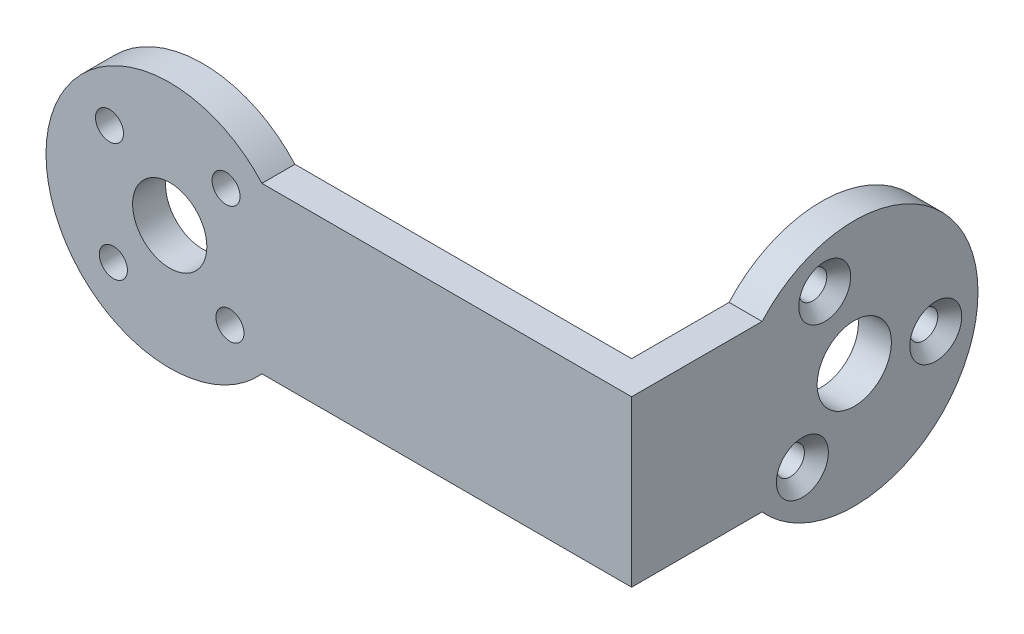
ISO-10303-21;
HEADER;
FILE_DESCRIPTION(('STEP AP214'),'2;1');
FILE_NAME('part.step','',(''),(''),'','','');
FILE_SCHEMA(('AUTOMOTIVE_DESIGN { 1 0 10303 214 1 1 1 1 }'));
ENDSEC;
DATA;
#1=APPLICATION_CONTEXT('core data for automotive mechanical design processes');
#2=APPLICATION_PROTOCOL_DEFINITION('international standard','automotive_design',2000,#1);
#3=PRODUCT_CONTEXT('',#1,'mechanical');
#4=PRODUCT('Part','Part','',(#3));
#5=PRODUCT_RELATED_PRODUCT_CATEGORY('part','',(#4));
#6=PRODUCT_DEFINITION_FORMATION('','',#4);
#7=PRODUCT_DEFINITION_CONTEXT('part definition',#1,'design');
#8=PRODUCT_DEFINITION('design','',#6,#7);
#9=PRODUCT_DEFINITION_SHAPE('','',#8);
#10=(LENGTH_UNIT() NAMED_UNIT(*) SI_UNIT(.MILLI.,.METRE.));
#11=(NAMED_UNIT(*) PLANE_ANGLE_UNIT() SI_UNIT($,.RADIAN.));
#12=(NAMED_UNIT(*) SI_UNIT($,.STERADIAN.) SOLID_ANGLE_UNIT());
#13=UNCERTAINTY_MEASURE_WITH_UNIT(LENGTH_MEASURE(1.E-05),#10,'distance_accuracy_value','');
#14=(GEOMETRIC_REPRESENTATION_CONTEXT(3) GLOBAL_UNCERTAINTY_ASSIGNED_CONTEXT((#13)) GLOBAL_UNIT_ASSIGNED_CONTEXT((#10,
#11,#12)) REPRESENTATION_CONTEXT('',''));
#15=CARTESIAN_POINT('',(0.,0.,0.));
#16=DIRECTION('',(0.,0.,1.));
#17=DIRECTION('',(1.,0.,0.));
#18=AXIS2_PLACEMENT_3D('',#15,#16,#17);
#19=CARTESIAN_POINT('',(0.,0.,0.));
#20=DIRECTION('',(0.,0.,1.));
#21=DIRECTION('',(1.,0.,0.));
#22=AXIS2_PLACEMENT_3D('',#19,#20,#21);
#23=PLANE('',#22);
#24=CARTESIAN_POINT('',(6.83081605405966,7.30342057091117,0.));
#25=DIRECTION('',(0.,0.,-1.));
#26=DIRECTION('',(-1.,0.,0.));
#27=AXIS2_PLACEMENT_3D('',#24,#25,#26);
#28=CIRCLE('',#27,3.15);
#29=CARTESIAN_POINT('',(3.68081605405966,7.30342057091117,0.));
#30=VERTEX_POINT('',#29);
#31=EDGE_CURVE('E147',#30,#30,#28,.T.);
#32=ORIENTED_EDGE('',*,*,#31,.F.);
#33=EDGE_LOOP('',(#32));
#34=FACE_BOUND('',#33,.T.);
#35=CARTESIAN_POINT('',(0.,0.,0.));
#36=DIRECTION('',(0.,0.,1.));
#37=DIRECTION('',(1.,0.,0.));
#38=AXIS2_PLACEMENT_3D('',#35,#36,#37);
#39=CIRCLE('',#38,4.5);
#40=CARTESIAN_POINT('',(4.5,0.,0.));
#41=VERTEX_POINT('',#40);
#42=EDGE_CURVE('E122',#41,#41,#39,.T.);
#43=ORIENTED_EDGE('',*,*,#42,.T.);
#44=EDGE_LOOP('',(#43));
#45=FACE_BOUND('',#44,.T.);
#46=DIRECTION('',(-1.,0.,0.));
#47=VECTOR('',#46,1.);
#48=CARTESIAN_POINT('',(11.1803398874989,10.,0.));
#49=LINE('',#48,#47);
#50=CARTESIAN_POINT('',(52.,10.,0.));
#51=VERTEX_POINT('',#50);
#52=CARTESIAN_POINT('',(11.1803398874989,10.,0.));
#53=VERTEX_POINT('',#52);
#54=EDGE_CURVE('E74',#51,#53,#49,.T.);
#55=ORIENTED_EDGE('',*,*,#54,.F.);
#56=DIRECTION('',(0.,-1.,0.));
#57=VECTOR('',#56,1.);
#58=CARTESIAN_POINT('',(52.,10.,0.));
#59=LINE('',#58,#57);
#60=CARTESIAN_POINT('',(52.,-10.,0.));
#61=VERTEX_POINT('',#60);
#62=EDGE_CURVE('E114',#51,#61,#59,.T.);
#63=ORIENTED_EDGE('',*,*,#62,.T.);
#64=DIRECTION('',(1.,0.,0.));
#65=VECTOR('',#64,1.);
#66=CARTESIAN_POINT('',(11.1803398874989,-10.,0.));
#67=LINE('',#66,#65);
#68=CARTESIAN_POINT('',(11.1803398874989,-10.,0.));
#69=VERTEX_POINT('',#68);
#70=EDGE_CURVE('E113',#69,#61,#67,.T.);
#71=ORIENTED_EDGE('',*,*,#70,.F.);
#72=CARTESIAN_POINT('',(0.,0.,0.));
#73=DIRECTION('',(0.,0.,1.));
#74=DIRECTION('',(1.,0.,0.));
#75=AXIS2_PLACEMENT_3D('',#72,#73,#74);
#76=CIRCLE('',#75,15.);
#77=EDGE_CURVE('E127',#53,#69,#76,.T.);
#78=ORIENTED_EDGE('',*,*,#77,.F.);
#79=EDGE_LOOP('',(#55,#63,#71,#78));
#80=FACE_BOUND('',#79,.T.);
#81=CARTESIAN_POINT('',(7.30342057091089,-6.8308160540594,0.));
#82=DIRECTION('',(0.,0.,-1.));
#83=DIRECTION('',(-1.,0.,0.));
#84=AXIS2_PLACEMENT_3D('',#81,#82,#83);
#85=CIRCLE('',#84,3.15);
#86=CARTESIAN_POINT('',(4.15342057091089,-6.8308160540594,0.));
#87=VERTEX_POINT('',#86);
#88=EDGE_CURVE('E194',#87,#87,#85,.T.);
#89=ORIENTED_EDGE('',*,*,#88,.F.);
#90=EDGE_LOOP('',(#89));
#91=FACE_BOUND('',#90,.T.);
#92=CARTESIAN_POINT('',(-6.83081605405939,-7.30342057091089,0.));
#93=DIRECTION('',(0.,0.,-1.));
#94=DIRECTION('',(-1.,0.,0.));
#95=AXIS2_PLACEMENT_3D('',#92,#93,#94);
#96=CIRCLE('',#95,3.15);
#97=CARTESIAN_POINT('',(-9.9808160540594,-7.30342057091089,0.));
#98=VERTEX_POINT('',#97);
#99=EDGE_CURVE('E185',#98,#98,#96,.T.);
#100=ORIENTED_EDGE('',*,*,#99,.F.);
#101=EDGE_LOOP('',(#100));
#102=FACE_BOUND('',#101,.T.);
#103=CARTESIAN_POINT('',(-7.30342057091105,6.83081605405923,0.));
#104=DIRECTION('',(0.,0.,-1.));
#105=DIRECTION('',(-1.,0.,0.));
#106=AXIS2_PLACEMENT_3D('',#103,#104,#105);
#107=CIRCLE('',#106,3.15);
#108=CARTESIAN_POINT('',(-10.4534205709111,6.83081605405923,0.));
#109=VERTEX_POINT('',#108);
#110=EDGE_CURVE('E176',#109,#109,#107,.T.);
#111=ORIENTED_EDGE('',*,*,#110,.F.);
#112=EDGE_LOOP('',(#111));
#113=FACE_BOUND('',#112,.T.);
#114=ADVANCED_FACE('F33',(#34,#45,#80,#91,#102,#113),#23,.F.);
#115=CARTESIAN_POINT('',(0.,0.,4.));
#116=DIRECTION('',(0.,0.,1.));
#117=DIRECTION('',(1.,0.,0.));
#118=AXIS2_PLACEMENT_3D('',#115,#116,#117);
#119=PLANE('',#118);
#120=CARTESIAN_POINT('',(6.83081605405966,7.30342057091117,4.));
#121=DIRECTION('',(0.,0.,-1.));
#122=DIRECTION('',(-1.,0.,0.));
#123=AXIS2_PLACEMENT_3D('',#120,#121,#122);
#124=CIRCLE('',#123,1.7);
#125=CARTESIAN_POINT('',(5.13081605405966,7.30342057091117,4.));
#126=VERTEX_POINT('',#125);
#127=EDGE_CURVE('E173',#126,#126,#124,.T.);
#128=ORIENTED_EDGE('',*,*,#127,.T.);
#129=EDGE_LOOP('',(#128));
#130=FACE_BOUND('',#129,.T.);
#131=CARTESIAN_POINT('',(-7.30342057091105,6.83081605405923,4.));
#132=DIRECTION('',(0.,0.,-1.));
#133=DIRECTION('',(-1.,0.,0.));
#134=AXIS2_PLACEMENT_3D('',#131,#132,#133);
#135=CIRCLE('',#134,1.7);
#136=CARTESIAN_POINT('',(-9.00342057091105,6.83081605405923,4.));
#137=VERTEX_POINT('',#136);
#138=EDGE_CURVE('E182',#137,#137,#135,.T.);
#139=ORIENTED_EDGE('',*,*,#138,.T.);
#140=EDGE_LOOP('',(#139));
#141=FACE_BOUND('',#140,.T.);
#142=CARTESIAN_POINT('',(-6.83081605405939,-7.30342057091089,4.));
#143=DIRECTION('',(0.,0.,-1.));
#144=DIRECTION('',(-1.,0.,0.));
#145=AXIS2_PLACEMENT_3D('',#142,#143,#144);
#146=CIRCLE('',#145,1.7);
#147=CARTESIAN_POINT('',(-8.5308160540594,-7.30342057091089,4.));
#148=VERTEX_POINT('',#147);
#149=EDGE_CURVE('E191',#148,#148,#146,.T.);
#150=ORIENTED_EDGE('',*,*,#149,.T.);
#151=EDGE_LOOP('',(#150));
#152=FACE_BOUND('',#151,.T.);
#153=CARTESIAN_POINT('',(7.30342057091089,-6.8308160540594,4.));
#154=DIRECTION('',(0.,0.,-1.));
#155=DIRECTION('',(-1.,0.,0.));
#156=AXIS2_PLACEMENT_3D('',#153,#154,#155);
#157=CIRCLE('',#156,1.7);
#158=CARTESIAN_POINT('',(5.60342057091089,-6.8308160540594,4.));
#159=VERTEX_POINT('',#158);
#160=EDGE_CURVE('E200',#159,#159,#157,.T.);
#161=ORIENTED_EDGE('',*,*,#160,.T.);
#162=EDGE_LOOP('',(#161));
#163=FACE_BOUND('',#162,.T.);
#164=CARTESIAN_POINT('',(0.,0.,4.));
#165=DIRECTION('',(0.,0.,1.));
#166=DIRECTION('',(1.,0.,0.));
#167=AXIS2_PLACEMENT_3D('',#164,#165,#166);
#168=CIRCLE('',#167,4.5);
#169=CARTESIAN_POINT('',(4.5,0.,4.));
#170=VERTEX_POINT('',#169);
#171=EDGE_CURVE('E124',#170,#170,#168,.T.);
#172=ORIENTED_EDGE('',*,*,#171,.F.);
#173=EDGE_LOOP('',(#172));
#174=FACE_BOUND('',#173,.T.);
#175=CARTESIAN_POINT('',(0.,0.,4.));
#176=DIRECTION('',(0.,0.,1.));
#177=DIRECTION('',(1.,0.,0.));
#178=AXIS2_PLACEMENT_3D('',#175,#176,#177);
#179=CIRCLE('',#178,15.);
#180=CARTESIAN_POINT('',(11.1803398874989,10.,4.));
#181=VERTEX_POINT('',#180);
#182=CARTESIAN_POINT('',(11.1803398874989,-10.,4.));
#183=VERTEX_POINT('',#182);
#184=EDGE_CURVE('E130',#181,#183,#179,.T.);
#185=ORIENTED_EDGE('',*,*,#184,.T.);
#186=DIRECTION('',(1.,0.,0.));
#187=VECTOR('',#186,1.);
#188=CARTESIAN_POINT('',(11.1803398874989,-10.,4.));
#189=LINE('',#188,#187);
#190=CARTESIAN_POINT('',(56.,-10.,4.));
#191=VERTEX_POINT('',#190);
#192=EDGE_CURVE('E81',#183,#191,#189,.T.);
#193=ORIENTED_EDGE('',*,*,#192,.T.);
#194=DIRECTION('',(0.,1.,0.));
#195=VECTOR('',#194,1.);
#196=CARTESIAN_POINT('',(56.,10.,4.));
#197=LINE('',#196,#195);
#198=CARTESIAN_POINT('',(56.,10.,4.));
#199=VERTEX_POINT('',#198);
#200=EDGE_CURVE('E133',#191,#199,#197,.T.);
#201=ORIENTED_EDGE('',*,*,#200,.T.);
#202=DIRECTION('',(-1.,0.,0.));
#203=VECTOR('',#202,1.);
#204=CARTESIAN_POINT('',(11.1803398874989,10.,4.));
#205=LINE('',#204,#203);
#206=EDGE_CURVE('E59',#199,#181,#205,.T.);
#207=ORIENTED_EDGE('',*,*,#206,.T.);
#208=EDGE_LOOP('',(#185,#193,#201,#207));
#209=FACE_BOUND('',#208,.T.);
#210=ADVANCED_FACE('F226',(#130,#141,#152,#163,#174,#209),#119,.T.);
#211=CARTESIAN_POINT('',(0.,0.,4.));
#212=DIRECTION('',(0.,0.,-1.));
#213=DIRECTION('',(-1.,0.,0.));
#214=AXIS2_PLACEMENT_3D('',#211,#212,#213);
#215=CYLINDRICAL_SURFACE('',#214,15.);
#216=ORIENTED_EDGE('',*,*,#77,.T.);
#217=DIRECTION('',(0.,0.,-1.));
#218=VECTOR('',#217,1.);
#219=CARTESIAN_POINT('',(11.1803398874989,-10.,4.));
#220=LINE('',#219,#218);
#221=EDGE_CURVE('E11',#183,#69,#220,.T.);
#222=ORIENTED_EDGE('',*,*,#221,.F.);
#223=ORIENTED_EDGE('',*,*,#184,.F.);
#224=DIRECTION('',(0.,0.,-1.));
#225=VECTOR('',#224,1.);
#226=CARTESIAN_POINT('',(11.1803398874989,10.,4.));
#227=LINE('',#226,#225);
#228=EDGE_CURVE('E136',#181,#53,#227,.T.);
#229=ORIENTED_EDGE('',*,*,#228,.T.);
#230=EDGE_LOOP('',(#216,#222,#223,#229));
#231=FACE_BOUND('',#230,.T.);
#232=ADVANCED_FACE('F35',(#231),#215,.T.);
#233=CARTESIAN_POINT('',(11.1803398874989,-10.,4.));
#234=DIRECTION('',(0.,1.,0.));
#235=DIRECTION('',(0.,0.,1.));
#236=AXIS2_PLACEMENT_3D('',#233,#234,#235);
#237=PLANE('',#236);
#238=ORIENTED_EDGE('',*,*,#70,.T.);
#239=DIRECTION('',(0.,0.,-1.));
#240=VECTOR('',#239,1.);
#241=CARTESIAN_POINT('',(52.,-10.,0.));
#242=LINE('',#241,#240);
#243=CARTESIAN_POINT('',(52.,-10.,-11.8196601125011));
#244=VERTEX_POINT('',#243);
#245=EDGE_CURVE('E50',#61,#244,#242,.T.);
#246=ORIENTED_EDGE('',*,*,#245,.T.);
#247=DIRECTION('',(1.,0.,0.));
#248=VECTOR('',#247,1.);
#249=CARTESIAN_POINT('',(52.,-10.,-11.8196601125011));
#250=LINE('',#249,#248);
#251=CARTESIAN_POINT('',(56.,-10.,-11.8196601125011));
#252=VERTEX_POINT('',#251);
#253=EDGE_CURVE('E99',#244,#252,#250,.T.);
#254=ORIENTED_EDGE('',*,*,#253,.T.);
#255=DIRECTION('',(0.,0.,-1.));
#256=VECTOR('',#255,1.);
#257=CARTESIAN_POINT('',(56.,-10.,4.));
#258=LINE('',#257,#256);
#259=EDGE_CURVE('E42',#191,#252,#258,.T.);
#260=ORIENTED_EDGE('',*,*,#259,.F.);
#261=ORIENTED_EDGE('',*,*,#192,.F.);
#262=ORIENTED_EDGE('',*,*,#221,.T.);
#263=EDGE_LOOP('',(#238,#246,#254,#260,#261,#262));
#264=FACE_BOUND('',#263,.T.);
#265=ADVANCED_FACE('F112',(#264),#237,.F.);
#266=CARTESIAN_POINT('',(56.,10.,4.));
#267=DIRECTION('',(-1.,0.,0.));
#268=DIRECTION('',(0.,0.,1.));
#269=AXIS2_PLACEMENT_3D('',#266,#267,#268);
#270=PLANE('',#269);
#271=CARTESIAN_POINT('',(56.,9.3358000491003,-19.416309521845));
#272=DIRECTION('',(1.,0.,0.));
#273=DIRECTION('',(0.,0.,-1.));
#274=AXIS2_PLACEMENT_3D('',#271,#272,#273);
#275=CIRCLE('',#274,3.15);
#276=CARTESIAN_POINT('',(56.,9.3358000491003,-22.566309521845));
#277=VERTEX_POINT('',#276);
#278=EDGE_CURVE('E309',#277,#277,#275,.T.);
#279=ORIENTED_EDGE('',*,*,#278,.F.);
#280=EDGE_LOOP('',(#279));
#281=FACE_BOUND('',#280,.T.);
#282=CARTESIAN_POINT('',(56.,-1.56433303116751,-32.8768852462504));
#283=DIRECTION('',(1.,0.,0.));
#284=DIRECTION('',(0.,0.,-1.));
#285=AXIS2_PLACEMENT_3D('',#282,#283,#284);
#286=CIRCLE('',#285,3.15);
#287=CARTESIAN_POINT('',(56.,-1.56433303116751,-36.0268852462504));
#288=VERTEX_POINT('',#287);
#289=EDGE_CURVE('E158',#288,#288,#286,.T.);
#290=ORIENTED_EDGE('',*,*,#289,.F.);
#291=EDGE_LOOP('',(#290));
#292=FACE_BOUND('',#291,.T.);
#293=CARTESIAN_POINT('',(56.,-7.77146701793278,-16.7068052319046));
#294=DIRECTION('',(1.,0.,0.));
#295=DIRECTION('',(0.,0.,-1.));
#296=AXIS2_PLACEMENT_3D('',#293,#294,#295);
#297=CIRCLE('',#296,3.15);
#298=CARTESIAN_POINT('',(56.,-7.77146701793278,-19.8568052319046));
#299=VERTEX_POINT('',#298);
#300=EDGE_CURVE('E151',#299,#299,#297,.T.);
#301=ORIENTED_EDGE('',*,*,#300,.F.);
#302=EDGE_LOOP('',(#301));
#303=FACE_BOUND('',#302,.T.);
#304=ORIENTED_EDGE('',*,*,#259,.T.);
#305=CARTESIAN_POINT('',(56.,0.,-23.));
#306=DIRECTION('',(1.,0.,0.));
#307=DIRECTION('',(0.,0.,1.));
#308=AXIS2_PLACEMENT_3D('',#305,#306,#307);
#309=CIRCLE('',#308,15.);
#310=CARTESIAN_POINT('',(56.,10.,-11.8196601125011));
#311=VERTEX_POINT('',#310);
#312=EDGE_CURVE('E105',#252,#311,#309,.T.);
#313=ORIENTED_EDGE('',*,*,#312,.T.);
#314=DIRECTION('',(0.,0.,-1.));
#315=VECTOR('',#314,1.);
#316=CARTESIAN_POINT('',(56.,10.,4.));
#317=LINE('',#316,#315);
#318=EDGE_CURVE('E142',#199,#311,#317,.T.);
#319=ORIENTED_EDGE('',*,*,#318,.F.);
#320=ORIENTED_EDGE('',*,*,#200,.F.);
#321=EDGE_LOOP('',(#304,#313,#319,#320));
#322=FACE_BOUND('',#321,.T.);
#323=CARTESIAN_POINT('',(56.,0.,-23.));
#324=DIRECTION('',(1.,0.,0.));
#325=DIRECTION('',(0.,0.,-1.));
#326=AXIS2_PLACEMENT_3D('',#323,#324,#325);
#327=CIRCLE('',#326,4.50000000000001);
#328=CARTESIAN_POINT('',(56.,0.,-27.5));
#329=VERTEX_POINT('',#328);
#330=EDGE_CURVE('E203',#329,#329,#327,.T.);
#331=ORIENTED_EDGE('',*,*,#330,.F.);
#332=EDGE_LOOP('',(#331));
#333=FACE_BOUND('',#332,.T.);
#334=ADVANCED_FACE('F210',(#281,#292,#303,#322,#333),#270,.F.);
#335=CARTESIAN_POINT('',(11.1803398874989,10.,4.));
#336=DIRECTION('',(0.,-1.,0.));
#337=DIRECTION('',(0.,0.,-1.));
#338=AXIS2_PLACEMENT_3D('',#335,#336,#337);
#339=PLANE('',#338);
#340=ORIENTED_EDGE('',*,*,#318,.T.);
#341=DIRECTION('',(1.,0.,0.));
#342=VECTOR('',#341,1.);
#343=CARTESIAN_POINT('',(52.,10.,-11.8196601125011));
#344=LINE('',#343,#342);
#345=CARTESIAN_POINT('',(52.,10.,-11.8196601125011));
#346=VERTEX_POINT('',#345);
#347=EDGE_CURVE('E106',#346,#311,#344,.T.);
#348=ORIENTED_EDGE('',*,*,#347,.F.);
#349=DIRECTION('',(0.,0.,1.));
#350=VECTOR('',#349,1.);
#351=CARTESIAN_POINT('',(52.,10.,0.));
#352=LINE('',#351,#350);
#353=EDGE_CURVE('E107',#346,#51,#352,.T.);
#354=ORIENTED_EDGE('',*,*,#353,.T.);
#355=ORIENTED_EDGE('',*,*,#54,.T.);
#356=ORIENTED_EDGE('',*,*,#228,.F.);
#357=ORIENTED_EDGE('',*,*,#206,.F.);
#358=EDGE_LOOP('',(#340,#348,#354,#355,#356,#357));
#359=FACE_BOUND('',#358,.T.);
#360=ADVANCED_FACE('F212',(#359),#339,.F.);
#361=CARTESIAN_POINT('',(0.,0.,4.));
#362=DIRECTION('',(0.,0.,-1.));
#363=DIRECTION('',(-1.,0.,0.));
#364=AXIS2_PLACEMENT_3D('',#361,#362,#363);
#365=CYLINDRICAL_SURFACE('',#364,4.5);
#366=ORIENTED_EDGE('',*,*,#171,.T.);
#367=EDGE_LOOP('',(#366));
#368=FACE_BOUND('',#367,.T.);
#369=ORIENTED_EDGE('',*,*,#42,.F.);
#370=EDGE_LOOP('',(#369));
#371=FACE_BOUND('',#370,.T.);
#372=ADVANCED_FACE('F220',(#368,#371),#365,.F.);
#373=CARTESIAN_POINT('',(52.,0.,-23.));
#374=DIRECTION('',(1.,0.,0.));
#375=DIRECTION('',(0.,0.,-1.));
#376=AXIS2_PLACEMENT_3D('',#373,#374,#375);
#377=CYLINDRICAL_SURFACE('',#376,15.);
#378=ORIENTED_EDGE('',*,*,#312,.F.);
#379=ORIENTED_EDGE('',*,*,#253,.F.);
#380=CARTESIAN_POINT('',(52.,0.,-23.));
#381=DIRECTION('',(1.,0.,0.));
#382=DIRECTION('',(0.,0.,1.));
#383=AXIS2_PLACEMENT_3D('',#380,#381,#382);
#384=CIRCLE('',#383,15.);
#385=EDGE_CURVE('E102',#244,#346,#384,.T.);
#386=ORIENTED_EDGE('',*,*,#385,.T.);
#387=ORIENTED_EDGE('',*,*,#347,.T.);
#388=EDGE_LOOP('',(#378,#379,#386,#387));
#389=FACE_BOUND('',#388,.T.);
#390=ADVANCED_FACE('F100',(#389),#377,.T.);
#391=CARTESIAN_POINT('',(52.,0.,-23.));
#392=DIRECTION('',(-1.,0.,0.));
#393=DIRECTION('',(0.,0.,1.));
#394=AXIS2_PLACEMENT_3D('',#391,#392,#393);
#395=PLANE('',#394);
#396=CARTESIAN_POINT('',(52.,9.3358000491003,-19.416309521845));
#397=DIRECTION('',(-1.,0.,0.));
#398=DIRECTION('',(0.,0.,1.));
#399=AXIS2_PLACEMENT_3D('',#396,#397,#398);
#400=CIRCLE('',#399,1.69999999999999);
#401=CARTESIAN_POINT('',(52.,9.3358000491003,-17.716309521845));
#402=VERTEX_POINT('',#401);
#403=EDGE_CURVE('E37',#402,#402,#400,.T.);
#404=ORIENTED_EDGE('',*,*,#403,.F.);
#405=EDGE_LOOP('',(#404));
#406=FACE_BOUND('',#405,.T.);
#407=CARTESIAN_POINT('',(52.,-1.56433303116751,-32.8768852462504));
#408=DIRECTION('',(-1.,0.,0.));
#409=DIRECTION('',(0.,0.,1.));
#410=AXIS2_PLACEMENT_3D('',#407,#408,#409);
#411=CIRCLE('',#410,1.69999999999999);
#412=CARTESIAN_POINT('',(52.,-1.56433303116751,-31.1768852462504));
#413=VERTEX_POINT('',#412);
#414=EDGE_CURVE('E149',#413,#413,#411,.T.);
#415=ORIENTED_EDGE('',*,*,#414,.F.);
#416=EDGE_LOOP('',(#415));
#417=FACE_BOUND('',#416,.T.);
#418=CARTESIAN_POINT('',(52.,-7.77146701793278,-16.7068052319046));
#419=DIRECTION('',(-1.,0.,0.));
#420=DIRECTION('',(0.,0.,1.));
#421=AXIS2_PLACEMENT_3D('',#418,#419,#420);
#422=CIRCLE('',#421,1.69999999999999);
#423=CARTESIAN_POINT('',(52.,-7.77146701793278,-15.0068052319046));
#424=VERTEX_POINT('',#423);
#425=EDGE_CURVE('E145',#424,#424,#422,.T.);
#426=ORIENTED_EDGE('',*,*,#425,.F.);
#427=EDGE_LOOP('',(#426));
#428=FACE_BOUND('',#427,.T.);
#429=CARTESIAN_POINT('',(52.,0.,-23.));
#430=DIRECTION('',(1.,0.,0.));
#431=DIRECTION('',(0.,0.,-1.));
#432=AXIS2_PLACEMENT_3D('',#429,#430,#431);
#433=CIRCLE('',#432,4.50000000000001);
#434=CARTESIAN_POINT('',(52.,0.,-27.5));
#435=VERTEX_POINT('',#434);
#436=EDGE_CURVE('E121',#435,#435,#433,.T.);
#437=ORIENTED_EDGE('',*,*,#436,.T.);
#438=EDGE_LOOP('',(#437));
#439=FACE_BOUND('',#438,.T.);
#440=ORIENTED_EDGE('',*,*,#62,.F.);
#441=ORIENTED_EDGE('',*,*,#353,.F.);
#442=ORIENTED_EDGE('',*,*,#385,.F.);
#443=ORIENTED_EDGE('',*,*,#245,.F.);
#444=EDGE_LOOP('',(#440,#441,#442,#443));
#445=FACE_BOUND('',#444,.T.);
#446=ADVANCED_FACE('F109',(#406,#417,#428,#439,#445),#395,.T.);
#447=CARTESIAN_POINT('',(52.,0.,-23.));
#448=DIRECTION('',(1.,0.,0.));
#449=DIRECTION('',(0.,0.,-1.));
#450=AXIS2_PLACEMENT_3D('',#447,#448,#449);
#451=CYLINDRICAL_SURFACE('',#450,4.50000000000001);
#452=ORIENTED_EDGE('',*,*,#436,.F.);
#453=EDGE_LOOP('',(#452));
#454=FACE_BOUND('',#453,.T.);
#455=ORIENTED_EDGE('',*,*,#330,.T.);
#456=EDGE_LOOP('',(#455));
#457=FACE_BOUND('',#456,.T.);
#458=ADVANCED_FACE('F208',(#454,#457),#451,.F.);
#459=CARTESIAN_POINT('',(7.30342057091089,-6.8308160540594,0.));
#460=DIRECTION('',(0.,0.,-1.));
#461=DIRECTION('',(-1.,0.,0.));
#462=AXIS2_PLACEMENT_3D('',#459,#460,#461);
#463=CYLINDRICAL_SURFACE('',#462,1.69999999999999);
#464=ORIENTED_EDGE('',*,*,#160,.F.);
#465=EDGE_LOOP('',(#464));
#466=FACE_BOUND('',#465,.T.);
#467=CARTESIAN_POINT('',(7.30342057091089,-6.8308160540594,1.45000000000001));
#468=DIRECTION('',(0.,0.,-1.));
#469=DIRECTION('',(-1.,0.,0.));
#470=AXIS2_PLACEMENT_3D('',#467,#468,#469);
#471=CIRCLE('',#470,1.69999999999999);
#472=CARTESIAN_POINT('',(5.60342057091091,-6.8308160540594,1.45000000000001));
#473=VERTEX_POINT('',#472);
#474=EDGE_CURVE('E197',#473,#473,#471,.T.);
#475=ORIENTED_EDGE('',*,*,#474,.T.);
#476=EDGE_LOOP('',(#475));
#477=FACE_BOUND('',#476,.T.);
#478=ADVANCED_FACE('F247',(#466,#477),#463,.F.);
#479=CARTESIAN_POINT('',(7.30342057091089,-6.8308160540594,0.));
#480=DIRECTION('',(0.,0.,-1.));
#481=DIRECTION('',(-1.,0.,0.));
#482=AXIS2_PLACEMENT_3D('',#479,#480,#481);
#483=CONICAL_SURFACE('',#482,3.15,0.78539816339745);
#484=ORIENTED_EDGE('',*,*,#474,.F.);
#485=EDGE_LOOP('',(#484));
#486=FACE_BOUND('',#485,.T.);
#487=ORIENTED_EDGE('',*,*,#88,.T.);
#488=EDGE_LOOP('',(#487));
#489=FACE_BOUND('',#488,.T.);
#490=ADVANCED_FACE('F251',(#486,#489),#483,.F.);
#491=CARTESIAN_POINT('',(-6.83081605405939,-7.30342057091089,0.));
#492=DIRECTION('',(0.,0.,-1.));
#493=DIRECTION('',(-1.,0.,0.));
#494=AXIS2_PLACEMENT_3D('',#491,#492,#493);
#495=CYLINDRICAL_SURFACE('',#494,1.69999999999999);
#496=ORIENTED_EDGE('',*,*,#149,.F.);
#497=EDGE_LOOP('',(#496));
#498=FACE_BOUND('',#497,.T.);
#499=CARTESIAN_POINT('',(-6.83081605405939,-7.30342057091089,1.45000000000001));
#500=DIRECTION('',(0.,0.,-1.));
#501=DIRECTION('',(-1.,0.,0.));
#502=AXIS2_PLACEMENT_3D('',#499,#500,#501);
#503=CIRCLE('',#502,1.69999999999999);
#504=CARTESIAN_POINT('',(-8.53081605405938,-7.30342057091089,1.45000000000001));
#505=VERTEX_POINT('',#504);
#506=EDGE_CURVE('E188',#505,#505,#503,.T.);
#507=ORIENTED_EDGE('',*,*,#506,.T.);
#508=EDGE_LOOP('',(#507));
#509=FACE_BOUND('',#508,.T.);
#510=ADVANCED_FACE('F255',(#498,#509),#495,.F.);
#511=CARTESIAN_POINT('',(-6.83081605405939,-7.30342057091089,0.));
#512=DIRECTION('',(0.,0.,-1.));
#513=DIRECTION('',(-1.,0.,0.));
#514=AXIS2_PLACEMENT_3D('',#511,#512,#513);
#515=CONICAL_SURFACE('',#514,3.15,0.78539816339745);
#516=ORIENTED_EDGE('',*,*,#506,.F.);
#517=EDGE_LOOP('',(#516));
#518=FACE_BOUND('',#517,.T.);
#519=ORIENTED_EDGE('',*,*,#99,.T.);
#520=EDGE_LOOP('',(#519));
#521=FACE_BOUND('',#520,.T.);
#522=ADVANCED_FACE('F259',(#518,#521),#515,.F.);
#523=CARTESIAN_POINT('',(-7.30342057091105,6.83081605405923,0.));
#524=DIRECTION('',(0.,0.,-1.));
#525=DIRECTION('',(-1.,0.,0.));
#526=AXIS2_PLACEMENT_3D('',#523,#524,#525);
#527=CYLINDRICAL_SURFACE('',#526,1.69999999999999);
#528=ORIENTED_EDGE('',*,*,#138,.F.);
#529=EDGE_LOOP('',(#528));
#530=FACE_BOUND('',#529,.T.);
#531=CARTESIAN_POINT('',(-7.30342057091105,6.83081605405923,1.45000000000001));
#532=DIRECTION('',(0.,0.,-1.));
#533=DIRECTION('',(-1.,0.,0.));
#534=AXIS2_PLACEMENT_3D('',#531,#532,#533);
#535=CIRCLE('',#534,1.69999999999999);
#536=CARTESIAN_POINT('',(-9.00342057091104,6.83081605405923,1.45000000000001));
#537=VERTEX_POINT('',#536);
#538=EDGE_CURVE('E179',#537,#537,#535,.T.);
#539=ORIENTED_EDGE('',*,*,#538,.T.);
#540=EDGE_LOOP('',(#539));
#541=FACE_BOUND('',#540,.T.);
#542=ADVANCED_FACE('F263',(#530,#541),#527,.F.);
#543=CARTESIAN_POINT('',(-7.30342057091105,6.83081605405923,0.));
#544=DIRECTION('',(0.,0.,-1.));
#545=DIRECTION('',(-1.,0.,0.));
#546=AXIS2_PLACEMENT_3D('',#543,#544,#545);
#547=CONICAL_SURFACE('',#546,3.15,0.78539816339745);
#548=ORIENTED_EDGE('',*,*,#538,.F.);
#549=EDGE_LOOP('',(#548));
#550=FACE_BOUND('',#549,.T.);
#551=ORIENTED_EDGE('',*,*,#110,.T.);
#552=EDGE_LOOP('',(#551));
#553=FACE_BOUND('',#552,.T.);
#554=ADVANCED_FACE('F267',(#550,#553),#547,.F.);
#555=CARTESIAN_POINT('',(6.83081605405966,7.30342057091117,0.));
#556=DIRECTION('',(0.,0.,-1.));
#557=DIRECTION('',(-1.,0.,0.));
#558=AXIS2_PLACEMENT_3D('',#555,#556,#557);
#559=CYLINDRICAL_SURFACE('',#558,1.69999999999999);
#560=ORIENTED_EDGE('',*,*,#127,.F.);
#561=EDGE_LOOP('',(#560));
#562=FACE_BOUND('',#561,.T.);
#563=CARTESIAN_POINT('',(6.83081605405966,7.30342057091117,1.45000000000001));
#564=DIRECTION('',(0.,0.,-1.));
#565=DIRECTION('',(-1.,0.,0.));
#566=AXIS2_PLACEMENT_3D('',#563,#564,#565);
#567=CIRCLE('',#566,1.69999999999999);
#568=CARTESIAN_POINT('',(5.13081605405967,7.30342057091117,1.45000000000001));
#569=VERTEX_POINT('',#568);
#570=EDGE_CURVE('E170',#569,#569,#567,.T.);
#571=ORIENTED_EDGE('',*,*,#570,.T.);
#572=EDGE_LOOP('',(#571));
#573=FACE_BOUND('',#572,.T.);
#574=ADVANCED_FACE('F271',(#562,#573),#559,.F.);
#575=CARTESIAN_POINT('',(6.83081605405966,7.30342057091117,0.));
#576=DIRECTION('',(0.,0.,-1.));
#577=DIRECTION('',(-1.,0.,0.));
#578=AXIS2_PLACEMENT_3D('',#575,#576,#577);
#579=CONICAL_SURFACE('',#578,3.15,0.78539816339745);
#580=ORIENTED_EDGE('',*,*,#570,.F.);
#581=EDGE_LOOP('',(#580));
#582=FACE_BOUND('',#581,.T.);
#583=ORIENTED_EDGE('',*,*,#31,.T.);
#584=EDGE_LOOP('',(#583));
#585=FACE_BOUND('',#584,.T.);
#586=ADVANCED_FACE('F275',(#582,#585),#579,.F.);
#587=CARTESIAN_POINT('',(56.,-7.77146701793278,-16.7068052319046));
#588=DIRECTION('',(1.,0.,0.));
#589=DIRECTION('',(0.,0.,-1.));
#590=AXIS2_PLACEMENT_3D('',#587,#588,#589);
#591=CYLINDRICAL_SURFACE('',#590,1.69999999999999);
#592=ORIENTED_EDGE('',*,*,#425,.T.);
#593=EDGE_LOOP('',(#592));
#594=FACE_BOUND('',#593,.T.);
#595=CARTESIAN_POINT('',(54.55,-7.77146701793278,-16.7068052319046));
#596=DIRECTION('',(1.,0.,0.));
#597=DIRECTION('',(0.,0.,-1.));
#598=AXIS2_PLACEMENT_3D('',#595,#596,#597);
#599=CIRCLE('',#598,1.69999999999999);
#600=CARTESIAN_POINT('',(54.55,-7.77146701793278,-18.4068052319046));
#601=VERTEX_POINT('',#600);
#602=EDGE_CURVE('E148',#601,#601,#599,.T.);
#603=ORIENTED_EDGE('',*,*,#602,.T.);
#604=EDGE_LOOP('',(#603));
#605=FACE_BOUND('',#604,.T.);
#606=ADVANCED_FACE('F279',(#594,#605),#591,.F.);
#607=CARTESIAN_POINT('',(56.,-7.77146701793278,-16.7068052319046));
#608=DIRECTION('',(1.,0.,0.));
#609=DIRECTION('',(0.,0.,-1.));
#610=AXIS2_PLACEMENT_3D('',#607,#608,#609);
#611=CONICAL_SURFACE('',#610,3.15,0.78539816339745);
#612=ORIENTED_EDGE('',*,*,#602,.F.);
#613=EDGE_LOOP('',(#612));
#614=FACE_BOUND('',#613,.T.);
#615=ORIENTED_EDGE('',*,*,#300,.T.);
#616=EDGE_LOOP('',(#615));
#617=FACE_BOUND('',#616,.T.);
#618=ADVANCED_FACE('F283',(#614,#617),#611,.F.);
#619=CARTESIAN_POINT('',(56.,-1.56433303116751,-32.8768852462504));
#620=DIRECTION('',(1.,0.,0.));
#621=DIRECTION('',(0.,0.,-1.));
#622=AXIS2_PLACEMENT_3D('',#619,#620,#621);
#623=CYLINDRICAL_SURFACE('',#622,1.69999999999999);
#624=ORIENTED_EDGE('',*,*,#414,.T.);
#625=EDGE_LOOP('',(#624));
#626=FACE_BOUND('',#625,.T.);
#627=CARTESIAN_POINT('',(54.55,-1.56433303116751,-32.8768852462504));
#628=DIRECTION('',(1.,0.,0.));
#629=DIRECTION('',(0.,0.,-1.));
#630=AXIS2_PLACEMENT_3D('',#627,#628,#629);
#631=CIRCLE('',#630,1.69999999999999);
#632=CARTESIAN_POINT('',(54.55,-1.56433303116751,-34.5768852462504));
#633=VERTEX_POINT('',#632);
#634=EDGE_CURVE('E152',#633,#633,#631,.T.);
#635=ORIENTED_EDGE('',*,*,#634,.T.);
#636=EDGE_LOOP('',(#635));
#637=FACE_BOUND('',#636,.T.);
#638=ADVANCED_FACE('F287',(#626,#637),#623,.F.);
#639=CARTESIAN_POINT('',(56.,-1.56433303116751,-32.8768852462504));
#640=DIRECTION('',(1.,0.,0.));
#641=DIRECTION('',(0.,0.,-1.));
#642=AXIS2_PLACEMENT_3D('',#639,#640,#641);
#643=CONICAL_SURFACE('',#642,3.15,0.78539816339745);
#644=ORIENTED_EDGE('',*,*,#634,.F.);
#645=EDGE_LOOP('',(#644));
#646=FACE_BOUND('',#645,.T.);
#647=ORIENTED_EDGE('',*,*,#289,.T.);
#648=EDGE_LOOP('',(#647));
#649=FACE_BOUND('',#648,.T.);
#650=ADVANCED_FACE('F291',(#646,#649),#643,.F.);
#651=CARTESIAN_POINT('',(56.,9.3358000491003,-19.416309521845));
#652=DIRECTION('',(1.,0.,0.));
#653=DIRECTION('',(0.,0.,-1.));
#654=AXIS2_PLACEMENT_3D('',#651,#652,#653);
#655=CYLINDRICAL_SURFACE('',#654,1.69999999999999);
#656=ORIENTED_EDGE('',*,*,#403,.T.);
#657=EDGE_LOOP('',(#656));
#658=FACE_BOUND('',#657,.T.);
#659=CARTESIAN_POINT('',(54.55,9.3358000491003,-19.416309521845));
#660=DIRECTION('',(1.,0.,0.));
#661=DIRECTION('',(0.,0.,-1.));
#662=AXIS2_PLACEMENT_3D('',#659,#660,#661);
#663=CIRCLE('',#662,1.69999999999999);
#664=CARTESIAN_POINT('',(54.55,9.3358000491003,-21.116309521845));
#665=VERTEX_POINT('',#664);
#666=EDGE_CURVE('E307',#665,#665,#663,.T.);
#667=ORIENTED_EDGE('',*,*,#666,.T.);
#668=EDGE_LOOP('',(#667));
#669=FACE_BOUND('',#668,.T.);
#670=ADVANCED_FACE('F294',(#658,#669),#655,.F.);
#671=CARTESIAN_POINT('',(56.,9.3358000491003,-19.416309521845));
#672=DIRECTION('',(1.,0.,0.));
#673=DIRECTION('',(0.,0.,-1.));
#674=AXIS2_PLACEMENT_3D('',#671,#672,#673);
#675=CONICAL_SURFACE('',#674,3.15,0.78539816339745);
#676=ORIENTED_EDGE('',*,*,#666,.F.);
#677=EDGE_LOOP('',(#676));
#678=FACE_BOUND('',#677,.T.);
#679=ORIENTED_EDGE('',*,*,#278,.T.);
#680=EDGE_LOOP('',(#679));
#681=FACE_BOUND('',#680,.T.);
#682=ADVANCED_FACE('F298',(#678,#681),#675,.F.);
#683=CLOSED_SHELL('',(#114,#210,#232,#265,#334,#360,#372,#390,#446,#458,#478,#490,#510,#522,
#542,#554,#574,#586,#606,#618,#638,#650,#670,#682));
#684=MANIFOLD_SOLID_BREP('B2',#683);
#685=ADVANCED_BREP_SHAPE_REPRESENTATION('',(#18,#684),#14);
#686=SHAPE_DEFINITION_REPRESENTATION(#9,#685);
ENDSEC;
END-ISO-10303-21;
